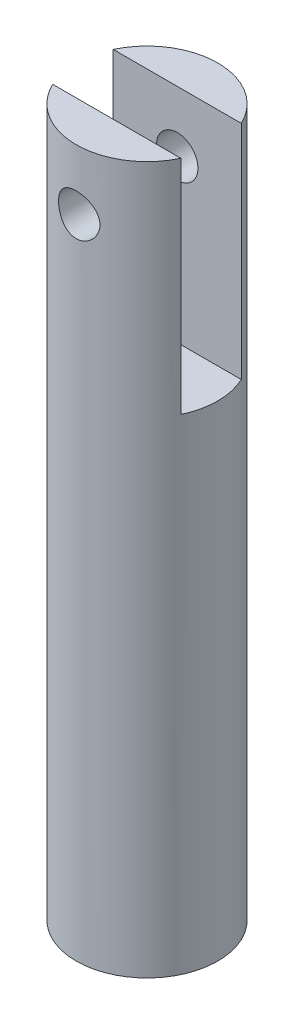
ISO-10303-21;
HEADER;
FILE_DESCRIPTION(('STEP AP214'),'2;1');
FILE_NAME('part.step','',(''),(''),'','','');
FILE_SCHEMA(('AUTOMOTIVE_DESIGN { 1 0 10303 214 1 1 1 1 }'));
ENDSEC;
DATA;
#1=APPLICATION_CONTEXT('core data for automotive mechanical design processes');
#2=APPLICATION_PROTOCOL_DEFINITION('international standard','automotive_design',2000,#1);
#3=PRODUCT_CONTEXT('',#1,'mechanical');
#4=PRODUCT('Part','Part','',(#3));
#5=PRODUCT_RELATED_PRODUCT_CATEGORY('part','',(#4));
#6=PRODUCT_DEFINITION_FORMATION('','',#4);
#7=PRODUCT_DEFINITION_CONTEXT('part definition',#1,'design');
#8=PRODUCT_DEFINITION('design','',#6,#7);
#9=PRODUCT_DEFINITION_SHAPE('','',#8);
#10=(LENGTH_UNIT() NAMED_UNIT(*) SI_UNIT(.MILLI.,.METRE.));
#11=(NAMED_UNIT(*) PLANE_ANGLE_UNIT() SI_UNIT($,.RADIAN.));
#12=(NAMED_UNIT(*) SI_UNIT($,.STERADIAN.) SOLID_ANGLE_UNIT());
#13=UNCERTAINTY_MEASURE_WITH_UNIT(LENGTH_MEASURE(1.E-05),#10,'distance_accuracy_value','');
#14=(GEOMETRIC_REPRESENTATION_CONTEXT(3) GLOBAL_UNCERTAINTY_ASSIGNED_CONTEXT((#13)) GLOBAL_UNIT_ASSIGNED_CONTEXT((#10,
#11,#12)) REPRESENTATION_CONTEXT('',''));
#15=CARTESIAN_POINT('',(0.,0.,0.));
#16=DIRECTION('',(0.,0.,1.));
#17=DIRECTION('',(1.,0.,0.));
#18=AXIS2_PLACEMENT_3D('',#15,#16,#17);
#19=CARTESIAN_POINT('',(0.,55.5244,0.));
#20=DIRECTION('',(0.,1.,0.));
#21=DIRECTION('',(0.,0.,1.));
#22=AXIS2_PLACEMENT_3D('',#19,#20,#21);
#23=PLANE('',#22);
#24=DIRECTION('',(1.,0.,0.));
#25=VECTOR('',#24,1.);
#26=CARTESIAN_POINT('',(-5.5626,55.5244,2.3749));
#27=LINE('',#26,#25);
#28=CARTESIAN_POINT('',(-5.03014599688717,55.5244,2.3749));
#29=VERTEX_POINT('',#28);
#30=CARTESIAN_POINT('',(5.03014599688717,55.5244,2.3749));
#31=VERTEX_POINT('',#30);
#32=EDGE_CURVE('E66',#29,#31,#27,.T.);
#33=ORIENTED_EDGE('',*,*,#32,.F.);
#34=CARTESIAN_POINT('',(0.,55.5244,0.));
#35=DIRECTION('',(0.,1.,0.));
#36=DIRECTION('',(0.,0.,1.));
#37=AXIS2_PLACEMENT_3D('',#34,#35,#36);
#38=CIRCLE('',#37,5.5626);
#39=EDGE_CURVE('E100',#29,#31,#38,.T.);
#40=ORIENTED_EDGE('',*,*,#39,.T.);
#41=EDGE_LOOP('',(#33,#40));
#42=FACE_BOUND('',#41,.T.);
#43=ADVANCED_FACE('F42',(#42),#23,.T.);
#44=CARTESIAN_POINT('',(0.,50.7619,-5.5626));
#45=DIRECTION('',(0.,0.,1.));
#46=DIRECTION('',(1.,0.,0.));
#47=AXIS2_PLACEMENT_3D('',#44,#45,#46);
#48=CYLINDRICAL_SURFACE('',#47,1.6256);
#49=CARTESIAN_POINT('',(0.,50.7619,2.3749));
#50=DIRECTION('',(0.,0.,1.));
#51=DIRECTION('',(1.,0.,0.));
#52=AXIS2_PLACEMENT_3D('',#49,#50,#51);
#53=CIRCLE('',#52,1.6256);
#54=CARTESIAN_POINT('',(1.6256,50.7619,2.3749));
#55=VERTEX_POINT('',#54);
#56=EDGE_CURVE('E151',#55,#55,#53,.F.);
#57=ORIENTED_EDGE('',*,*,#56,.T.);
#58=EDGE_LOOP('',(#57));
#59=FACE_BOUND('',#58,.T.);
#60=CARTESIAN_POINT('',(1.6256,50.7619,5.31976911153107));
#61=CARTESIAN_POINT('',(1.62559860911774,50.6727073763668,5.31977022332635));
#62=CARTESIAN_POINT('',(1.61823435322175,50.5835008673593,5.32203679535459));
#63=CARTESIAN_POINT('',(1.58904284626172,50.4076881958567,5.3308242288224));
#64=CARTESIAN_POINT('',(1.56721019055251,50.321083017726,5.3373466800241));
#65=CARTESIAN_POINT('',(1.50988033144056,50.1530430450573,5.35384544178888));
#66=CARTESIAN_POINT('',(1.47440499127675,50.0716002195425,5.36381622362921));
#67=CARTESIAN_POINT('',(1.39086788334388,49.915803739403,5.38608081743125));
#68=CARTESIAN_POINT('',(1.34280444316134,49.8414510285394,5.39837493800362));
#69=CARTESIAN_POINT('',(1.2339106044409,49.6997126667761,5.42431495108298));
#70=CARTESIAN_POINT('',(1.17276860546345,49.632571418858,5.4379885092705));
#71=CARTESIAN_POINT('',(1.04012160015769,49.5093347173916,5.46490981992957));
#72=CARTESIAN_POINT('',(0.968615329668879,49.4532406132673,5.47815752021679));
#73=CARTESIAN_POINT('',(0.815541576818624,49.3526394854366,5.50304737926425));
#74=CARTESIAN_POINT('',(0.733804873888852,49.3083801511428,5.51465312911552));
#75=CARTESIAN_POINT('',(0.563652545225148,49.234328490393,5.53463097857799));
#76=CARTESIAN_POINT('',(0.475238287043735,49.204533210956,5.54300373816493));
#77=CARTESIAN_POINT('',(0.296796180786302,49.1610599160426,5.55537650541175));
#78=CARTESIAN_POINT('',(0.206877852188644,49.1469650642879,5.55948938994933));
#79=CARTESIAN_POINT('',(0.0258649663168093,49.1339762860252,5.56327581583758));
#80=CARTESIAN_POINT('',(-0.0652293524782892,49.1350793244514,5.56295024356201));
#81=CARTESIAN_POINT('',(-0.243089680250863,49.1521718771572,5.55797693832002));
#82=CARTESIAN_POINT('',(-0.329903278825552,49.1677102587869,5.55346019271141));
#83=CARTESIAN_POINT('',(-0.499632167055188,49.2124974673552,5.5407701089115));
#84=CARTESIAN_POINT('',(-0.582547214580027,49.2417471446366,5.53259654393413));
#85=CARTESIAN_POINT('',(-0.743216827983788,49.3134417067001,5.51332694431989));
#86=CARTESIAN_POINT('',(-0.820902746271597,49.3560315109104,5.50219902808411));
#87=CARTESIAN_POINT('',(-0.968171727907061,49.4530836146357,5.47820568078583));
#88=CARTESIAN_POINT('',(-1.03775294294031,49.5075486142415,5.4653398548243));
#89=CARTESIAN_POINT('',(-1.16953033047235,49.6291585295794,5.438695262825));
#90=CARTESIAN_POINT('',(-1.23136230922651,49.6966950535515,5.42490031936694));
#91=CARTESIAN_POINT('',(-1.34292246360166,49.8413155949643,5.39836780772112));
#92=CARTESIAN_POINT('',(-1.39264956061072,49.9184004622926,5.38563033382632));
#93=CARTESIAN_POINT('',(-1.47894251166811,50.0808468198504,5.36258041577077));
#94=CARTESIAN_POINT('',(-1.51539024528845,50.1662744098317,5.35229000587636));
#95=CARTESIAN_POINT('',(-1.57327783009204,50.3424241352145,5.33556312668468));
#96=CARTESIAN_POINT('',(-1.59472228474595,50.4331446373224,5.32912547532951));
#97=CARTESIAN_POINT('',(-1.62132682423832,50.6138531143437,5.32109064087243));
#98=CARTESIAN_POINT('',(-1.6270380299569,50.7037527436874,5.31932971901631));
#99=CARTESIAN_POINT('',(-1.62354803980955,50.8832267119706,5.32039608773556));
#100=CARTESIAN_POINT('',(-1.61434880535221,50.9728010921419,5.32322277482943));
#101=CARTESIAN_POINT('',(-1.58178876239406,51.146826588044,5.3329857559311));
#102=CARTESIAN_POINT('',(-1.55877705878121,51.2313492823409,5.33982064917635));
#103=CARTESIAN_POINT('',(-1.49964707823016,51.3953302391972,5.35672630981704));
#104=CARTESIAN_POINT('',(-1.463526849327,51.4747877454366,5.36679755910634));
#105=CARTESIAN_POINT('',(-1.37814219439039,51.6286399020341,5.38936313901538));
#106=CARTESIAN_POINT('',(-1.32856383317895,51.7028519671595,5.40191308856363));
#107=CARTESIAN_POINT('',(-1.2180469609492,51.8421048562334,5.4278998600183));
#108=CARTESIAN_POINT('',(-1.15710587168402,51.9071435928237,5.44133688275719));
#109=CARTESIAN_POINT('',(-1.02301240391261,52.028584171759,5.46816193280682));
#110=CARTESIAN_POINT('',(-0.949502935462562,52.0845967829395,5.48153123708276));
#111=CARTESIAN_POINT('',(-0.793812911827997,52.1834975337878,5.50623126939497));
#112=CARTESIAN_POINT('',(-0.711632801751388,52.2263863467262,5.5175621019956));
#113=CARTESIAN_POINT('',(-0.54149338376179,52.2974097779136,5.53683749080375));
#114=CARTESIAN_POINT('',(-0.453583562937969,52.3256556902109,5.54480750186318));
#115=CARTESIAN_POINT('',(-0.27399194330564,52.366887802966,5.55657569708821));
#116=CARTESIAN_POINT('',(-0.182311170600119,52.379878126517,5.5603750084412));
#117=CARTESIAN_POINT('',(-0.00138619081735003,52.3899298762453,5.56330879440219));
#118=CARTESIAN_POINT('',(0.0878242908120433,52.3875572204567,5.56260900685069));
#119=CARTESIAN_POINT('',(0.26452169694,52.3682937916719,5.55701002192723));
#120=CARTESIAN_POINT('',(0.352008710470662,52.3514037706462,5.55211104206505));
#121=CARTESIAN_POINT('',(0.521951838575313,52.3039286155781,5.53870806833846));
#122=CARTESIAN_POINT('',(0.604448629544056,52.2734783693956,5.53023962439715));
#123=CARTESIAN_POINT('',(0.763206865296774,52.1998673394342,5.51057526813332));
#124=CARTESIAN_POINT('',(0.839467314153471,52.1567045305377,5.49937892130363));
#125=CARTESIAN_POINT('',(0.986137446527592,52.0573512031002,5.47501161708459));
#126=CARTESIAN_POINT('',(1.05629483465846,52.0008006247476,5.46179049368819));
#127=CARTESIAN_POINT('',(1.18631409636214,51.8769336615168,5.43503382478606));
#128=CARTESIAN_POINT('',(1.24617306194376,51.8096142461371,5.42149819169212));
#129=CARTESIAN_POINT('',(1.3555652562065,51.6638691499429,5.39520350252651));
#130=CARTESIAN_POINT('',(1.40476452136506,51.5851863935913,5.38247656860935));
#131=CARTESIAN_POINT('',(1.48917556444626,51.4203059593801,5.35973855833675));
#132=CARTESIAN_POINT('',(1.52439467868745,51.3341122520568,5.34972605841346));
#133=CARTESIAN_POINT('',(1.57631661124815,51.167449090557,5.33463994814927));
#134=CARTESIAN_POINT('',(1.59474888093206,51.0875559946296,5.32911416165711));
#135=CARTESIAN_POINT('',(1.61939013773795,50.925745598347,5.32167855114135));
#136=CARTESIAN_POINT('',(1.62560127760694,50.8438286570659,5.31976809028188));
#137=CARTESIAN_POINT('',(1.6256,50.7619,5.31976911153107));
#138=B_SPLINE_CURVE_WITH_KNOTS('',3,(#60,#61,#62,#63,#64,#65,#66,#67,#68,#69,#70,#71,#72,#73,
#74,#75,#76,#77,#78,#79,#80,#81,#82,#83,#84,#85,#86,#87,#88,#89,#90,#91,#92,#93,#94,#95,#96,#97,
#98,#99,#100,#101,#102,#103,#104,#105,#106,#107,#108,#109,#110,#111,#112,#113,#114,#115,#116,
#117,#118,#119,#120,#121,#122,#123,#124,#125,#126,#127,#128,#129,#130,#131,#132,#133,#134,#135,
#136,#137),.UNSPECIFIED.,.T.,.F.,(4,2,2,2,2,2,2,2,2,2,2,2,2,2,2,2,2,2,2,2,2,2,2,2,2,2,2,2,2,2,2,
2,2,2,2,2,2,2,4),(0.,0.267275889994316,0.534651676745373,0.801600751046707,1.06858530932863,
1.34282917658665,1.61710652236476,1.89674047023348,2.17631730400816,2.4482801886821,
2.72018876230949,2.98387560370443,3.24757880051296,3.51425234471475,3.78098658644829,
4.05749810967936,4.33403426260558,4.61297339699675,4.89182690664266,5.16078015091774,
5.42969801834375,5.69208952831222,5.95452012653171,6.2236948740446,6.49293077283842,
6.77173787497571,7.05053067149117,7.32717222091162,7.60373898583094,7.87017746675134,
8.1366021475243,8.40043384394886,8.66430759164813,8.93630234833085,9.20837378324113,
9.48802168637775,9.76752264496781,10.0130744867195,10.2585830707407),.UNSPECIFIED.);
#139=CARTESIAN_POINT('',(1.6256,50.7619,5.31976911153107));
#140=VERTEX_POINT('',#139);
#141=EDGE_CURVE('E99',#140,#140,#138,.T.);
#142=ORIENTED_EDGE('',*,*,#141,.F.);
#143=EDGE_LOOP('',(#142));
#144=FACE_BOUND('',#143,.T.);
#145=ADVANCED_FACE('F129',(#59,#144),#48,.F.);
#146=CARTESIAN_POINT('',(0.,55.5244,0.));
#147=DIRECTION('',(0.,-1.,0.));
#148=DIRECTION('',(0.,0.,-1.));
#149=AXIS2_PLACEMENT_3D('',#146,#147,#148);
#150=CYLINDRICAL_SURFACE('',#149,5.5626);
#151=CARTESIAN_POINT('',(0.,52.3875,-5.5626));
#152=CARTESIAN_POINT('',(-0.0892845040910537,52.3874986402863,-5.56259906349303));
#153=CARTESIAN_POINT('',(-0.178582846197011,52.3801197393198,-5.56042966092886));
#154=CARTESIAN_POINT('',(-0.354585801763526,52.3508647948924,-5.5519870987445));
#155=CARTESIAN_POINT('',(-0.441289517259433,52.3289837917347,-5.54571253517498));
#156=CARTESIAN_POINT('',(-0.609538786256495,52.2715127043421,-5.52974839947276));
#157=CARTESIAN_POINT('',(-0.691091527682393,52.2359422381372,-5.52006371598027));
#158=CARTESIAN_POINT('',(-0.847075051920992,52.152180546444,-5.49829000024847));
#159=CARTESIAN_POINT('',(-0.921504995605222,52.1039878364371,-5.48620068523754));
#160=CARTESIAN_POINT('',(-1.06316845725792,51.9949582666062,-5.46054082435697));
#161=CARTESIAN_POINT('',(-1.1301792917798,51.9338389488676,-5.44694110649029));
#162=CARTESIAN_POINT('',(-1.25316082192458,51.8012935324597,-5.41997036576016));
#163=CARTESIAN_POINT('',(-1.3091297727422,51.7298658079696,-5.40659937934453));
#164=CARTESIAN_POINT('',(-1.40958946289602,51.5768729757459,-5.38129394091482));
#165=CARTESIAN_POINT('',(-1.45381221306411,51.4951253165574,-5.36939588005192));
#166=CARTESIAN_POINT('',(-1.52779334461808,51.324950017102,-5.34881774664456));
#167=CARTESIAN_POINT('',(-1.55755499980499,51.2365238939936,-5.34013694586057));
#168=CARTESIAN_POINT('',(-1.60097328636098,51.0579944206606,-5.32727952698153));
#169=CARTESIAN_POINT('',(-1.61503886096469,50.9679989592317,-5.32298879227239));
#170=CARTESIAN_POINT('',(-1.62794225012846,50.7868312441927,-5.31905746543778));
#171=CARTESIAN_POINT('',(-1.62678354362785,50.6956592641891,-5.31941581093889));
#172=CARTESIAN_POINT('',(-1.60959329832514,50.5180187251343,-5.32464077241672));
#173=CARTESIAN_POINT('',(-1.59406971798449,50.4314957392816,-5.32935340716746));
#174=CARTESIAN_POINT('',(-1.54940934265448,50.2623399026102,-5.34250746392333));
#175=CARTESIAN_POINT('',(-1.52027126612868,50.1797074188117,-5.35094923694923));
#176=CARTESIAN_POINT('',(-1.44882540876377,50.0194161180293,-5.37073626536371));
#177=CARTESIAN_POINT('',(-1.40634969046135,49.9418368753855,-5.38211819734138));
#178=CARTESIAN_POINT('',(-1.30955108549503,49.7947349867169,-5.40648495662793));
#179=CARTESIAN_POINT('',(-1.25522545505967,49.7252142122975,-5.4194701548602));
#180=CARTESIAN_POINT('',(-1.13372826246394,49.5933163030424,-5.44620885430784));
#181=CARTESIAN_POINT('',(-1.06613389595558,49.5313300357546,-5.45997243876664));
#182=CARTESIAN_POINT('',(-0.921338567346312,49.419484412861,-5.48626108000415));
#183=CARTESIAN_POINT('',(-0.844137060955061,49.3696257448148,-5.49878606653816));
#184=CARTESIAN_POINT('',(-0.681634179065396,49.2832294912017,-5.52129094314407));
#185=CARTESIAN_POINT('',(-0.596286421131826,49.246774719699,-5.53125490013419));
#186=CARTESIAN_POINT('',(-0.420313325503126,49.1888500265324,-5.54740025306769));
#187=CARTESIAN_POINT('',(-0.329689388688187,49.1673761467675,-5.5535826480842));
#188=CARTESIAN_POINT('',(-0.14906235651274,49.1406645024473,-5.56131193454907));
#189=CARTESIAN_POINT('',(-0.0591440129309287,49.134896613416,-5.56301011935655));
#190=CARTESIAN_POINT('',(0.120379746527822,49.138280119353,-5.56202135141563));
#191=CARTESIAN_POINT('',(0.209985200420278,49.1474296338549,-5.55933495138166));
#192=CARTESIAN_POINT('',(0.384365129754862,49.1799579075231,-5.54997762328891));
#193=CARTESIAN_POINT('',(0.469201790491064,49.2030303141058,-5.54339253734614));
#194=CARTESIAN_POINT('',(0.633784278618788,49.2623839724853,-5.52699574734647));
#195=CARTESIAN_POINT('',(0.713529504867096,49.2986667806505,-5.5171836631176));
#196=CARTESIAN_POINT('',(0.867642699600112,49.3843235234601,-5.49508098613868));
#197=CARTESIAN_POINT('',(0.941850792804848,49.4339717398581,-5.48273993224551));
#198=CARTESIAN_POINT('',(1.08106438259774,49.5446139990531,-5.45699906088983));
#199=CARTESIAN_POINT('',(1.14606768239032,49.6056107422543,-5.44359899187006));
#200=CARTESIAN_POINT('',(1.26733720150152,49.7397064210284,-5.41667525585527));
#201=CARTESIAN_POINT('',(1.32322683635909,49.8131489557589,-5.40316314024408));
#202=CARTESIAN_POINT('',(1.42191052122963,49.9686630052245,-5.37803790276177));
#203=CARTESIAN_POINT('',(1.46470498082459,50.0507342499687,-5.36642472150238));
#204=CARTESIAN_POINT('',(1.53567901651551,50.2208686572468,-5.34654736160853));
#205=CARTESIAN_POINT('',(1.56393222721526,50.3088990242989,-5.33826635686541));
#206=CARTESIAN_POINT('',(1.60513855905348,50.4887523714977,-5.32602290148573));
#207=CARTESIAN_POINT('',(1.61809658657191,50.580574125658,-5.32205906602166));
#208=CARTESIAN_POINT('',(1.62802301105503,50.7615059652813,-5.31903029728456));
#209=CARTESIAN_POINT('',(1.62560306791224,50.8505798095491,-5.31977795393273));
#210=CARTESIAN_POINT('',(1.60629230355738,51.0269909466427,-5.32564018660682));
#211=CARTESIAN_POINT('',(1.58940200776359,51.1143283024026,-5.33075460407571));
#212=CARTESIAN_POINT('',(1.54201561371479,51.2838434845595,-5.34465166351492));
#213=CARTESIAN_POINT('',(1.51167362058424,51.3660680507152,-5.35339268763642));
#214=CARTESIAN_POINT('',(1.43836458621445,51.5243248000245,-5.3735523398212));
#215=CARTESIAN_POINT('',(1.39539522642426,51.6003558426882,-5.38497145954031));
#216=CARTESIAN_POINT('',(1.29630047472972,51.7469256673272,-5.40969629039477));
#217=CARTESIAN_POINT('',(1.23976961597841,51.8171815871361,-5.42305379093766));
#218=CARTESIAN_POINT('',(1.11589633402107,51.9474083122491,-5.44989028914595));
#219=CARTESIAN_POINT('',(1.04855115435936,52.0073764872341,-5.4633693169584));
#220=CARTESIAN_POINT('',(0.902749610395269,52.116948974056,-5.48937024423904));
#221=CARTESIAN_POINT('',(0.824040494959644,52.1662263783223,-5.50185605763242));
#222=CARTESIAN_POINT('',(0.659089660323411,52.2507771041912,-5.52404073156396));
#223=CARTESIAN_POINT('',(0.572851820294484,52.2860575863485,-5.53374101642135));
#224=CARTESIAN_POINT('',(0.406046621588802,52.3380946654017,-5.54831414220674));
#225=CARTESIAN_POINT('',(0.326051447306577,52.3565732812521,-5.55362837918179));
#226=CARTESIAN_POINT('',(0.164041207807611,52.3812756651791,-5.56077148003606));
#227=CARTESIAN_POINT('',(0.0820264437227524,52.3875012491807,-5.56260086037703));
#228=CARTESIAN_POINT('',(0.,52.3875,-5.5626));
#229=B_SPLINE_CURVE_WITH_KNOTS('',3,(#151,#152,#153,#154,#155,#156,#157,#158,#159,#160,#161,
#162,#163,#164,#165,#166,#167,#168,#169,#170,#171,#172,#173,#174,#175,#176,#177,#178,#179,#180,
#181,#182,#183,#184,#185,#186,#187,#188,#189,#190,#191,#192,#193,#194,#195,#196,#197,#198,#199,
#200,#201,#202,#203,#204,#205,#206,#207,#208,#209,#210,#211,#212,#213,#214,#215,#216,#217,#218,
#219,#220,#221,#222,#223,#224,#225,#226,#227,#228),.UNSPECIFIED.,.T.,.F.,(4,2,2,2,2,2,2,2,2,2,2,
2,2,2,2,2,2,2,2,2,2,2,2,2,2,2,2,2,2,2,2,2,2,2,2,2,2,2,4),(0.,0.267552330930991,
0.535196211597754,0.802457958160866,1.0697511518569,1.34363475228109,1.61756159636565,
1.89728572874474,2.17694650573362,2.44913733662583,2.72126596957878,2.98412507141089,
3.24700892123196,3.51334533795799,3.77974348876567,4.05666908854639,4.33361038463355,
4.61223506199158,4.89078609602405,5.15981132518394,5.42880264403236,5.69208066571458,
5.95538971523917,6.22457957045066,6.49383356202879,6.77233167384603,7.05082107409823,
7.32788601843774,7.60486206187136,7.87089223537609,8.13691274973861,8.39996141682669,
8.66305841332714,8.93530276305893,9.20761661545651,9.48735026487,9.76694062284809,
10.0127796927298,10.2585823260022),.UNSPECIFIED.);
#230=CARTESIAN_POINT('',(0.,52.3875,-5.5626));
#231=VERTEX_POINT('',#230);
#232=EDGE_CURVE('E103',#231,#231,#229,.T.);
#233=ORIENTED_EDGE('',*,*,#232,.T.);
#234=EDGE_LOOP('',(#233));
#235=FACE_BOUND('',#234,.T.);
#236=ORIENTED_EDGE('',*,*,#141,.T.);
#237=EDGE_LOOP('',(#236));
#238=FACE_BOUND('',#237,.T.);
#239=CARTESIAN_POINT('',(5.03014599688717,55.5244,-2.3749));
#240=VERTEX_POINT('',#239);
#241=CARTESIAN_POINT('',(-5.03014599688717,55.5244,-2.3749));
#242=VERTEX_POINT('',#241);
#243=EDGE_CURVE('E94',#240,#242,#38,.T.);
#244=ORIENTED_EDGE('',*,*,#243,.F.);
#245=DIRECTION('',(0.,-1.,0.));
#246=VECTOR('',#245,1.);
#247=CARTESIAN_POINT('',(5.03014599688717,55.5244,-2.3749));
#248=LINE('',#247,#246);
#249=CARTESIAN_POINT('',(5.03014599688717,38.1,-2.3749));
#250=VERTEX_POINT('',#249);
#251=EDGE_CURVE('E58',#240,#250,#248,.T.);
#252=ORIENTED_EDGE('',*,*,#251,.T.);
#253=CARTESIAN_POINT('',(0.,38.1,0.));
#254=DIRECTION('',(0.,-1.,0.));
#255=DIRECTION('',(0.,0.,-1.));
#256=AXIS2_PLACEMENT_3D('',#253,#254,#255);
#257=CIRCLE('',#256,5.5626);
#258=CARTESIAN_POINT('',(5.03014599688717,38.1,2.3749));
#259=VERTEX_POINT('',#258);
#260=EDGE_CURVE('E47',#250,#259,#257,.T.);
#261=ORIENTED_EDGE('',*,*,#260,.T.);
#262=DIRECTION('',(0.,-1.,0.));
#263=VECTOR('',#262,1.);
#264=CARTESIAN_POINT('',(5.03014599688717,55.5244,2.3749));
#265=LINE('',#264,#263);
#266=EDGE_CURVE('E148',#259,#31,#265,.F.);
#267=ORIENTED_EDGE('',*,*,#266,.T.);
#268=ORIENTED_EDGE('',*,*,#39,.F.);
#269=DIRECTION('',(0.,-1.,0.));
#270=VECTOR('',#269,1.);
#271=CARTESIAN_POINT('',(-5.03014599688717,55.5244,2.3749));
#272=LINE('',#271,#270);
#273=CARTESIAN_POINT('',(-5.03014599688717,38.1,2.3749));
#274=VERTEX_POINT('',#273);
#275=EDGE_CURVE('E109',#29,#274,#272,.T.);
#276=ORIENTED_EDGE('',*,*,#275,.T.);
#277=CARTESIAN_POINT('',(-5.03014599688717,38.1,-2.3749));
#278=VERTEX_POINT('',#277);
#279=EDGE_CURVE('E12',#274,#278,#257,.T.);
#280=ORIENTED_EDGE('',*,*,#279,.T.);
#281=DIRECTION('',(0.,-1.,0.));
#282=VECTOR('',#281,1.);
#283=CARTESIAN_POINT('',(-5.03014599688717,55.5244,-2.3749));
#284=LINE('',#283,#282);
#285=EDGE_CURVE('E85',#278,#242,#284,.F.);
#286=ORIENTED_EDGE('',*,*,#285,.T.);
#287=EDGE_LOOP('',(#244,#252,#261,#267,#268,#276,#280,#286));
#288=FACE_BOUND('',#287,.T.);
#289=CARTESIAN_POINT('',(0.,0.,0.));
#290=DIRECTION('',(0.,1.,0.));
#291=DIRECTION('',(0.,0.,1.));
#292=AXIS2_PLACEMENT_3D('',#289,#290,#291);
#293=CIRCLE('',#292,5.5626);
#294=CARTESIAN_POINT('',(0.,0.,5.5626));
#295=VERTEX_POINT('',#294);
#296=EDGE_CURVE('E106',#295,#295,#293,.T.);
#297=ORIENTED_EDGE('',*,*,#296,.T.);
#298=EDGE_LOOP('',(#297));
#299=FACE_BOUND('',#298,.T.);
#300=ADVANCED_FACE('F44',(#235,#238,#288,#299),#150,.T.);
#301=DIRECTION('',(1.,0.,0.));
#302=VECTOR('',#301,1.);
#303=CARTESIAN_POINT('',(-5.5626,55.5244,-2.3749));
#304=LINE('',#303,#302);
#305=EDGE_CURVE('E82',#242,#240,#304,.T.);
#306=ORIENTED_EDGE('',*,*,#305,.T.);
#307=ORIENTED_EDGE('',*,*,#243,.T.);
#308=EDGE_LOOP('',(#306,#307));
#309=FACE_BOUND('',#308,.T.);
#310=ADVANCED_FACE('F98',(#309),#23,.T.);
#311=CARTESIAN_POINT('',(0.,0.,0.));
#312=DIRECTION('',(0.,1.,0.));
#313=DIRECTION('',(0.,0.,1.));
#314=AXIS2_PLACEMENT_3D('',#311,#312,#313);
#315=PLANE('',#314);
#316=ORIENTED_EDGE('',*,*,#296,.F.);
#317=EDGE_LOOP('',(#316));
#318=FACE_BOUND('',#317,.T.);
#319=ADVANCED_FACE('F127',(#318),#315,.F.);
#320=CARTESIAN_POINT('',(0.,50.7619,-2.3749));
#321=DIRECTION('',(0.,0.,-1.));
#322=DIRECTION('',(-1.,0.,0.));
#323=AXIS2_PLACEMENT_3D('',#320,#321,#322);
#324=CIRCLE('',#323,1.6256);
#325=CARTESIAN_POINT('',(-1.6256,50.7619,-2.3749));
#326=VERTEX_POINT('',#325);
#327=EDGE_CURVE('E96',#326,#326,#324,.F.);
#328=ORIENTED_EDGE('',*,*,#327,.T.);
#329=EDGE_LOOP('',(#328));
#330=FACE_BOUND('',#329,.T.);
#331=ORIENTED_EDGE('',*,*,#232,.F.);
#332=EDGE_LOOP('',(#331));
#333=FACE_BOUND('',#332,.T.);
#334=ADVANCED_FACE('F121',(#330,#333),#48,.F.);
#335=CARTESIAN_POINT('',(-5.5626,38.1,-2.3749));
#336=DIRECTION('',(0.,-1.,0.));
#337=DIRECTION('',(0.,0.,-1.));
#338=AXIS2_PLACEMENT_3D('',#335,#336,#337);
#339=PLANE('',#338);
#340=DIRECTION('',(1.,0.,0.));
#341=VECTOR('',#340,1.);
#342=CARTESIAN_POINT('',(-5.5626,38.1,-2.3749));
#343=LINE('',#342,#341);
#344=EDGE_CURVE('E90',#278,#250,#343,.T.);
#345=ORIENTED_EDGE('',*,*,#344,.F.);
#346=ORIENTED_EDGE('',*,*,#279,.F.);
#347=DIRECTION('',(1.,0.,0.));
#348=VECTOR('',#347,1.);
#349=CARTESIAN_POINT('',(-5.5626,38.1,2.3749));
#350=LINE('',#349,#348);
#351=EDGE_CURVE('E155',#274,#259,#350,.T.);
#352=ORIENTED_EDGE('',*,*,#351,.T.);
#353=ORIENTED_EDGE('',*,*,#260,.F.);
#354=EDGE_LOOP('',(#345,#346,#352,#353));
#355=FACE_BOUND('',#354,.T.);
#356=ADVANCED_FACE('F126',(#355),#339,.F.);
#357=CARTESIAN_POINT('',(-5.5626,38.1,2.3749));
#358=DIRECTION('',(0.,0.,1.));
#359=DIRECTION('',(1.,0.,0.));
#360=AXIS2_PLACEMENT_3D('',#357,#358,#359);
#361=PLANE('',#360);
#362=ORIENTED_EDGE('',*,*,#56,.F.);
#363=EDGE_LOOP('',(#362));
#364=FACE_BOUND('',#363,.T.);
#365=ORIENTED_EDGE('',*,*,#32,.T.);
#366=ORIENTED_EDGE('',*,*,#266,.F.);
#367=ORIENTED_EDGE('',*,*,#351,.F.);
#368=ORIENTED_EDGE('',*,*,#275,.F.);
#369=EDGE_LOOP('',(#365,#366,#367,#368));
#370=FACE_BOUND('',#369,.T.);
#371=ADVANCED_FACE('F130',(#364,#370),#361,.F.);
#372=CARTESIAN_POINT('',(-5.5626,38.1,-2.3749));
#373=DIRECTION('',(0.,0.,-1.));
#374=DIRECTION('',(-1.,0.,0.));
#375=AXIS2_PLACEMENT_3D('',#372,#373,#374);
#376=PLANE('',#375);
#377=ORIENTED_EDGE('',*,*,#327,.F.);
#378=EDGE_LOOP('',(#377));
#379=FACE_BOUND('',#378,.T.);
#380=ORIENTED_EDGE('',*,*,#305,.F.);
#381=ORIENTED_EDGE('',*,*,#285,.F.);
#382=ORIENTED_EDGE('',*,*,#344,.T.);
#383=ORIENTED_EDGE('',*,*,#251,.F.);
#384=EDGE_LOOP('',(#380,#381,#382,#383));
#385=FACE_BOUND('',#384,.T.);
#386=ADVANCED_FACE('F84',(#379,#385),#376,.F.);
#387=CLOSED_SHELL('',(#43,#145,#300,#310,#319,#334,#356,#371,#386));
#388=MANIFOLD_SOLID_BREP('B2',#387);
#389=ADVANCED_BREP_SHAPE_REPRESENTATION('',(#18,#388),#14);
#390=SHAPE_DEFINITION_REPRESENTATION(#9,#389);
ENDSEC;
END-ISO-10303-21;
